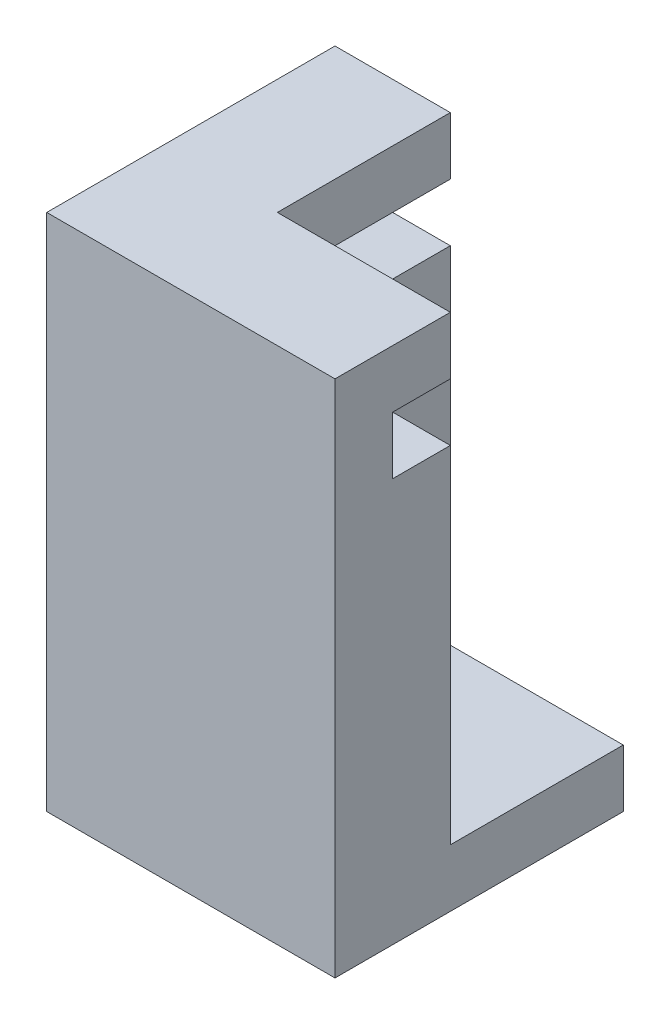
ISO-10303-21;
HEADER;
FILE_DESCRIPTION(('STEP AP214'),'2;1');
FILE_NAME('part.step','',(''),(''),'','','');
FILE_SCHEMA(('AUTOMOTIVE_DESIGN { 1 0 10303 214 1 1 1 1 }'));
ENDSEC;
DATA;
#1=APPLICATION_CONTEXT('core data for automotive mechanical design processes');
#2=APPLICATION_PROTOCOL_DEFINITION('international standard','automotive_design',2000,#1);
#3=PRODUCT_CONTEXT('',#1,'mechanical');
#4=PRODUCT('Part','Part','',(#3));
#5=PRODUCT_RELATED_PRODUCT_CATEGORY('part','',(#4));
#6=PRODUCT_DEFINITION_FORMATION('','',#4);
#7=PRODUCT_DEFINITION_CONTEXT('part definition',#1,'design');
#8=PRODUCT_DEFINITION('design','',#6,#7);
#9=PRODUCT_DEFINITION_SHAPE('','',#8);
#10=(LENGTH_UNIT() NAMED_UNIT(*) SI_UNIT(.MILLI.,.METRE.));
#11=(NAMED_UNIT(*) PLANE_ANGLE_UNIT() SI_UNIT($,.RADIAN.));
#12=(NAMED_UNIT(*) SI_UNIT($,.STERADIAN.) SOLID_ANGLE_UNIT());
#13=UNCERTAINTY_MEASURE_WITH_UNIT(LENGTH_MEASURE(1.E-05),#10,'distance_accuracy_value','');
#14=(GEOMETRIC_REPRESENTATION_CONTEXT(3) GLOBAL_UNCERTAINTY_ASSIGNED_CONTEXT((#13)) GLOBAL_UNIT_ASSIGNED_CONTEXT((#10,
#11,#12)) REPRESENTATION_CONTEXT('',''));
#15=CARTESIAN_POINT('',(0.,0.,0.));
#16=DIRECTION('',(0.,0.,1.));
#17=DIRECTION('',(1.,0.,0.));
#18=AXIS2_PLACEMENT_3D('',#15,#16,#17);
#19=CARTESIAN_POINT('',(25.,40.,-10.));
#20=DIRECTION('',(0.,0.,1.));
#21=DIRECTION('',(1.,0.,0.));
#22=AXIS2_PLACEMENT_3D('',#19,#20,#21);
#23=PLANE('',#22);
#24=DIRECTION('',(0.,-1.,0.));
#25=VECTOR('',#24,1.);
#26=CARTESIAN_POINT('',(10.,40.,-10.));
#27=LINE('',#26,#25);
#28=CARTESIAN_POINT('',(10.,30.,-10.));
#29=VERTEX_POINT('',#28);
#30=CARTESIAN_POINT('',(10.,0.,-10.));
#31=VERTEX_POINT('',#30);
#32=EDGE_CURVE('E77',#29,#31,#27,.T.);
#33=ORIENTED_EDGE('',*,*,#32,.F.);
#34=DIRECTION('',(1.,0.,0.));
#35=VECTOR('',#34,1.);
#36=CARTESIAN_POINT('',(25.,30.,-10.));
#37=LINE('',#36,#35);
#38=CARTESIAN_POINT('',(25.,30.,-10.));
#39=VERTEX_POINT('',#38);
#40=EDGE_CURVE('E194',#29,#39,#37,.T.);
#41=ORIENTED_EDGE('',*,*,#40,.T.);
#42=DIRECTION('',(0.,-1.,0.));
#43=VECTOR('',#42,1.);
#44=CARTESIAN_POINT('',(25.,40.,-10.));
#45=LINE('',#44,#43);
#46=CARTESIAN_POINT('',(25.,0.,-10.));
#47=VERTEX_POINT('',#46);
#48=EDGE_CURVE('E124',#39,#47,#45,.T.);
#49=ORIENTED_EDGE('',*,*,#48,.T.);
#50=DIRECTION('',(-1.,0.,0.));
#51=VECTOR('',#50,1.);
#52=CARTESIAN_POINT('',(25.,0.,-10.));
#53=LINE('',#52,#51);
#54=EDGE_CURVE('E136',#47,#31,#53,.T.);
#55=ORIENTED_EDGE('',*,*,#54,.T.);
#56=EDGE_LOOP('',(#33,#41,#49,#55));
#57=FACE_BOUND('',#56,.T.);
#58=ADVANCED_FACE('F39',(#57),#23,.F.);
#59=CARTESIAN_POINT('',(10.,40.,-10.));
#60=DIRECTION('',(-1.,0.,0.));
#61=DIRECTION('',(0.,0.,1.));
#62=AXIS2_PLACEMENT_3D('',#59,#60,#61);
#63=PLANE('',#62);
#64=DIRECTION('',(0.,-1.,0.));
#65=VECTOR('',#64,1.);
#66=CARTESIAN_POINT('',(10.,40.,-25.));
#67=LINE('',#66,#65);
#68=CARTESIAN_POINT('',(10.,30.,-25.));
#69=VERTEX_POINT('',#68);
#70=CARTESIAN_POINT('',(10.,0.,-25.));
#71=VERTEX_POINT('',#70);
#72=EDGE_CURVE('E88',#69,#71,#67,.T.);
#73=ORIENTED_EDGE('',*,*,#72,.F.);
#74=DIRECTION('',(0.,0.,1.));
#75=VECTOR('',#74,1.);
#76=CARTESIAN_POINT('',(10.,30.,-10.));
#77=LINE('',#76,#75);
#78=EDGE_CURVE('E276',#69,#29,#77,.T.);
#79=ORIENTED_EDGE('',*,*,#78,.T.);
#80=ORIENTED_EDGE('',*,*,#32,.T.);
#81=DIRECTION('',(0.,0.,-1.));
#82=VECTOR('',#81,1.);
#83=CARTESIAN_POINT('',(10.,0.,-10.));
#84=LINE('',#83,#82);
#85=EDGE_CURVE('E140',#31,#71,#84,.T.);
#86=ORIENTED_EDGE('',*,*,#85,.T.);
#87=EDGE_LOOP('',(#73,#79,#80,#86));
#88=FACE_BOUND('',#87,.T.);
#89=ADVANCED_FACE('F279',(#88),#63,.F.);
#90=CARTESIAN_POINT('',(0.,40.,-25.));
#91=DIRECTION('',(1.,0.,0.));
#92=DIRECTION('',(0.,0.,-1.));
#93=AXIS2_PLACEMENT_3D('',#90,#91,#92);
#94=PLANE('',#93);
#95=DIRECTION('',(0.,-1.,0.));
#96=VECTOR('',#95,1.);
#97=CARTESIAN_POINT('',(0.,40.,-25.));
#98=LINE('',#97,#96);
#99=CARTESIAN_POINT('',(0.,40.,-25.));
#100=VERTEX_POINT('',#99);
#101=CARTESIAN_POINT('',(0.,-5.,-25.));
#102=VERTEX_POINT('',#101);
#103=EDGE_CURVE('E132',#100,#102,#98,.T.);
#104=ORIENTED_EDGE('',*,*,#103,.T.);
#105=DIRECTION('',(0.,0.,-1.));
#106=VECTOR('',#105,1.);
#107=CARTESIAN_POINT('',(0.,-5.,0.));
#108=LINE('',#107,#106);
#109=CARTESIAN_POINT('',(0.,-5.,0.));
#110=VERTEX_POINT('',#109);
#111=EDGE_CURVE('E177',#110,#102,#108,.T.);
#112=ORIENTED_EDGE('',*,*,#111,.F.);
#113=DIRECTION('',(0.,-1.,0.));
#114=VECTOR('',#113,1.);
#115=CARTESIAN_POINT('',(0.,40.,0.));
#116=LINE('',#115,#114);
#117=CARTESIAN_POINT('',(0.,40.,0.));
#118=VERTEX_POINT('',#117);
#119=EDGE_CURVE('E48',#118,#110,#116,.T.);
#120=ORIENTED_EDGE('',*,*,#119,.F.);
#121=DIRECTION('',(0.,0.,1.));
#122=VECTOR('',#121,1.);
#123=CARTESIAN_POINT('',(0.,40.,-25.));
#124=LINE('',#123,#122);
#125=EDGE_CURVE('E144',#100,#118,#124,.T.);
#126=ORIENTED_EDGE('',*,*,#125,.F.);
#127=EDGE_LOOP('',(#104,#112,#120,#126));
#128=FACE_BOUND('',#127,.T.);
#129=ADVANCED_FACE('F41',(#128),#94,.F.);
#130=CARTESIAN_POINT('',(0.,40.,0.));
#131=DIRECTION('',(0.,0.,-1.));
#132=DIRECTION('',(-1.,0.,0.));
#133=AXIS2_PLACEMENT_3D('',#130,#131,#132);
#134=PLANE('',#133);
#135=ORIENTED_EDGE('',*,*,#119,.T.);
#136=DIRECTION('',(-1.,0.,0.));
#137=VECTOR('',#136,1.);
#138=CARTESIAN_POINT('',(0.,-5.,0.));
#139=LINE('',#138,#137);
#140=CARTESIAN_POINT('',(25.,-5.,0.));
#141=VERTEX_POINT('',#140);
#142=EDGE_CURVE('E165',#141,#110,#139,.T.);
#143=ORIENTED_EDGE('',*,*,#142,.F.);
#144=DIRECTION('',(0.,-1.,0.));
#145=VECTOR('',#144,1.);
#146=CARTESIAN_POINT('',(25.,40.,0.));
#147=LINE('',#146,#145);
#148=CARTESIAN_POINT('',(25.,40.,0.));
#149=VERTEX_POINT('',#148);
#150=EDGE_CURVE('E153',#149,#141,#147,.T.);
#151=ORIENTED_EDGE('',*,*,#150,.F.);
#152=DIRECTION('',(1.,0.,0.));
#153=VECTOR('',#152,1.);
#154=CARTESIAN_POINT('',(0.,40.,0.));
#155=LINE('',#154,#153);
#156=EDGE_CURVE('E166',#118,#149,#155,.T.);
#157=ORIENTED_EDGE('',*,*,#156,.F.);
#158=EDGE_LOOP('',(#135,#143,#151,#157));
#159=FACE_BOUND('',#158,.T.);
#160=ADVANCED_FACE('F162',(#159),#134,.F.);
#161=CARTESIAN_POINT('',(25.,40.,0.));
#162=DIRECTION('',(-1.,0.,0.));
#163=DIRECTION('',(0.,0.,1.));
#164=AXIS2_PLACEMENT_3D('',#161,#162,#163);
#165=PLANE('',#164);
#166=ORIENTED_EDGE('',*,*,#48,.F.);
#167=DIRECTION('',(0.,0.,-1.));
#168=VECTOR('',#167,1.);
#169=CARTESIAN_POINT('',(25.,30.,-5.));
#170=LINE('',#169,#168);
#171=CARTESIAN_POINT('',(25.,30.,-5.));
#172=VERTEX_POINT('',#171);
#173=EDGE_CURVE('E252',#172,#39,#170,.T.);
#174=ORIENTED_EDGE('',*,*,#173,.F.);
#175=DIRECTION('',(0.,-1.,0.));
#176=VECTOR('',#175,1.);
#177=CARTESIAN_POINT('',(25.,30.,-5.));
#178=LINE('',#177,#176);
#179=CARTESIAN_POINT('',(25.,35.,-5.));
#180=VERTEX_POINT('',#179);
#181=EDGE_CURVE('E255',#180,#172,#178,.T.);
#182=ORIENTED_EDGE('',*,*,#181,.F.);
#183=DIRECTION('',(0.,0.,-1.));
#184=VECTOR('',#183,1.);
#185=CARTESIAN_POINT('',(25.,35.,-5.));
#186=LINE('',#185,#184);
#187=CARTESIAN_POINT('',(25.,35.,-10.));
#188=VERTEX_POINT('',#187);
#189=EDGE_CURVE('E215',#180,#188,#186,.T.);
#190=ORIENTED_EDGE('',*,*,#189,.T.);
#191=CARTESIAN_POINT('',(25.,40.,-10.));
#192=VERTEX_POINT('',#191);
#193=EDGE_CURVE('E150',#192,#188,#45,.T.);
#194=ORIENTED_EDGE('',*,*,#193,.F.);
#195=DIRECTION('',(0.,0.,-1.));
#196=VECTOR('',#195,1.);
#197=CARTESIAN_POINT('',(25.,40.,0.));
#198=LINE('',#197,#196);
#199=EDGE_CURVE('E108',#149,#192,#198,.T.);
#200=ORIENTED_EDGE('',*,*,#199,.F.);
#201=ORIENTED_EDGE('',*,*,#150,.T.);
#202=DIRECTION('',(0.,0.,1.));
#203=VECTOR('',#202,1.);
#204=CARTESIAN_POINT('',(25.,-5.,0.));
#205=LINE('',#204,#203);
#206=CARTESIAN_POINT('',(25.,-5.,-25.));
#207=VERTEX_POINT('',#206);
#208=EDGE_CURVE('E179',#207,#141,#205,.T.);
#209=ORIENTED_EDGE('',*,*,#208,.F.);
#210=DIRECTION('',(0.,1.,0.));
#211=VECTOR('',#210,1.);
#212=CARTESIAN_POINT('',(25.,-5.,-25.));
#213=LINE('',#212,#211);
#214=CARTESIAN_POINT('',(25.,0.,-25.));
#215=VERTEX_POINT('',#214);
#216=EDGE_CURVE('E141',#207,#215,#213,.T.);
#217=ORIENTED_EDGE('',*,*,#216,.T.);
#218=DIRECTION('',(0.,0.,1.));
#219=VECTOR('',#218,1.);
#220=CARTESIAN_POINT('',(25.,0.,0.));
#221=LINE('',#220,#219);
#222=EDGE_CURVE('E185',#215,#47,#221,.T.);
#223=ORIENTED_EDGE('',*,*,#222,.T.);
#224=EDGE_LOOP('',(#166,#174,#182,#190,#194,#200,#201,#209,#217,#223));
#225=FACE_BOUND('',#224,.T.);
#226=ADVANCED_FACE('F210',(#225),#165,.F.);
#227=ORIENTED_EDGE('',*,*,#193,.T.);
#228=DIRECTION('',(-1.,0.,0.));
#229=VECTOR('',#228,1.);
#230=CARTESIAN_POINT('',(25.,35.,-10.));
#231=LINE('',#230,#229);
#232=CARTESIAN_POINT('',(10.,35.,-10.));
#233=VERTEX_POINT('',#232);
#234=EDGE_CURVE('E120',#188,#233,#231,.T.);
#235=ORIENTED_EDGE('',*,*,#234,.T.);
#236=CARTESIAN_POINT('',(10.,40.,-10.));
#237=VERTEX_POINT('',#236);
#238=EDGE_CURVE('E116',#237,#233,#27,.T.);
#239=ORIENTED_EDGE('',*,*,#238,.F.);
#240=DIRECTION('',(-1.,0.,0.));
#241=VECTOR('',#240,1.);
#242=CARTESIAN_POINT('',(25.,40.,-10.));
#243=LINE('',#242,#241);
#244=EDGE_CURVE('E101',#192,#237,#243,.T.);
#245=ORIENTED_EDGE('',*,*,#244,.F.);
#246=EDGE_LOOP('',(#227,#235,#239,#245));
#247=FACE_BOUND('',#246,.T.);
#248=ADVANCED_FACE('F117',(#247),#23,.F.);
#249=ORIENTED_EDGE('',*,*,#238,.T.);
#250=DIRECTION('',(0.,0.,-1.));
#251=VECTOR('',#250,1.);
#252=CARTESIAN_POINT('',(10.,35.,-10.));
#253=LINE('',#252,#251);
#254=CARTESIAN_POINT('',(10.,35.,-25.));
#255=VERTEX_POINT('',#254);
#256=EDGE_CURVE('E264',#233,#255,#253,.T.);
#257=ORIENTED_EDGE('',*,*,#256,.T.);
#258=CARTESIAN_POINT('',(10.,40.,-25.));
#259=VERTEX_POINT('',#258);
#260=EDGE_CURVE('E128',#259,#255,#67,.T.);
#261=ORIENTED_EDGE('',*,*,#260,.F.);
#262=DIRECTION('',(0.,0.,-1.));
#263=VECTOR('',#262,1.);
#264=CARTESIAN_POINT('',(10.,40.,-10.));
#265=LINE('',#264,#263);
#266=EDGE_CURVE('E105',#237,#259,#265,.T.);
#267=ORIENTED_EDGE('',*,*,#266,.F.);
#268=EDGE_LOOP('',(#249,#257,#261,#267));
#269=FACE_BOUND('',#268,.T.);
#270=ADVANCED_FACE('F126',(#269),#63,.F.);
#271=CARTESIAN_POINT('',(10.,40.,-25.));
#272=DIRECTION('',(0.,0.,1.));
#273=DIRECTION('',(1.,0.,0.));
#274=AXIS2_PLACEMENT_3D('',#271,#272,#273);
#275=PLANE('',#274);
#276=DIRECTION('',(0.,1.,0.));
#277=VECTOR('',#276,1.);
#278=CARTESIAN_POINT('',(5.,30.,-25.));
#279=LINE('',#278,#277);
#280=CARTESIAN_POINT('',(5.,30.,-25.));
#281=VERTEX_POINT('',#280);
#282=CARTESIAN_POINT('',(5.,35.,-25.));
#283=VERTEX_POINT('',#282);
#284=EDGE_CURVE('E55',#281,#283,#279,.T.);
#285=ORIENTED_EDGE('',*,*,#284,.F.);
#286=DIRECTION('',(1.,0.,0.));
#287=VECTOR('',#286,1.);
#288=CARTESIAN_POINT('',(10.,30.,-25.));
#289=LINE('',#288,#287);
#290=EDGE_CURVE('E11',#281,#69,#289,.T.);
#291=ORIENTED_EDGE('',*,*,#290,.T.);
#292=ORIENTED_EDGE('',*,*,#72,.T.);
#293=DIRECTION('',(1.,0.,0.));
#294=VECTOR('',#293,1.);
#295=CARTESIAN_POINT('',(0.,0.,-25.));
#296=LINE('',#295,#294);
#297=EDGE_CURVE('E191',#71,#215,#296,.T.);
#298=ORIENTED_EDGE('',*,*,#297,.T.);
#299=ORIENTED_EDGE('',*,*,#216,.F.);
#300=DIRECTION('',(1.,0.,0.));
#301=VECTOR('',#300,1.);
#302=CARTESIAN_POINT('',(0.,-5.,-25.));
#303=LINE('',#302,#301);
#304=EDGE_CURVE('E184',#102,#207,#303,.T.);
#305=ORIENTED_EDGE('',*,*,#304,.F.);
#306=ORIENTED_EDGE('',*,*,#103,.F.);
#307=DIRECTION('',(-1.,0.,0.));
#308=VECTOR('',#307,1.);
#309=CARTESIAN_POINT('',(10.,40.,-25.));
#310=LINE('',#309,#308);
#311=EDGE_CURVE('E64',#259,#100,#310,.T.);
#312=ORIENTED_EDGE('',*,*,#311,.F.);
#313=ORIENTED_EDGE('',*,*,#260,.T.);
#314=DIRECTION('',(1.,0.,0.));
#315=VECTOR('',#314,1.);
#316=CARTESIAN_POINT('',(5.,35.,-25.));
#317=LINE('',#316,#315);
#318=EDGE_CURVE('E285',#283,#255,#317,.T.);
#319=ORIENTED_EDGE('',*,*,#318,.F.);
#320=EDGE_LOOP('',(#285,#291,#292,#298,#299,#305,#306,#312,#313,#319));
#321=FACE_BOUND('',#320,.T.);
#322=ADVANCED_FACE('F240',(#321),#275,.F.);
#323=CARTESIAN_POINT('',(0.,40.,0.));
#324=DIRECTION('',(0.,1.,0.));
#325=DIRECTION('',(0.,0.,1.));
#326=AXIS2_PLACEMENT_3D('',#323,#324,#325);
#327=PLANE('',#326);
#328=ORIENTED_EDGE('',*,*,#125,.T.);
#329=ORIENTED_EDGE('',*,*,#156,.T.);
#330=ORIENTED_EDGE('',*,*,#199,.T.);
#331=ORIENTED_EDGE('',*,*,#244,.T.);
#332=ORIENTED_EDGE('',*,*,#266,.T.);
#333=ORIENTED_EDGE('',*,*,#311,.T.);
#334=EDGE_LOOP('',(#328,#329,#330,#331,#332,#333));
#335=FACE_BOUND('',#334,.T.);
#336=ADVANCED_FACE('F103',(#335),#327,.T.);
#337=CARTESIAN_POINT('',(0.,-5.,0.));
#338=DIRECTION('',(0.,-1.,0.));
#339=DIRECTION('',(0.,0.,-1.));
#340=AXIS2_PLACEMENT_3D('',#337,#338,#339);
#341=PLANE('',#340);
#342=ORIENTED_EDGE('',*,*,#111,.T.);
#343=ORIENTED_EDGE('',*,*,#304,.T.);
#344=ORIENTED_EDGE('',*,*,#208,.T.);
#345=ORIENTED_EDGE('',*,*,#142,.T.);
#346=EDGE_LOOP('',(#342,#343,#344,#345));
#347=FACE_BOUND('',#346,.T.);
#348=ADVANCED_FACE('F174',(#347),#341,.T.);
#349=CARTESIAN_POINT('',(0.,0.,0.));
#350=DIRECTION('',(0.,-1.,0.));
#351=DIRECTION('',(0.,0.,-1.));
#352=AXIS2_PLACEMENT_3D('',#349,#350,#351);
#353=PLANE('',#352);
#354=ORIENTED_EDGE('',*,*,#85,.F.);
#355=ORIENTED_EDGE('',*,*,#54,.F.);
#356=ORIENTED_EDGE('',*,*,#222,.F.);
#357=ORIENTED_EDGE('',*,*,#297,.F.);
#358=EDGE_LOOP('',(#354,#355,#356,#357));
#359=FACE_BOUND('',#358,.T.);
#360=ADVANCED_FACE('F244',(#359),#353,.F.);
#361=CARTESIAN_POINT('',(5.,30.,-5.));
#362=DIRECTION('',(0.,-1.,0.));
#363=DIRECTION('',(1.,0.,0.));
#364=AXIS2_PLACEMENT_3D('',#361,#362,#363);
#365=PLANE('',#364);
#366=ORIENTED_EDGE('',*,*,#78,.F.);
#367=ORIENTED_EDGE('',*,*,#290,.F.);
#368=DIRECTION('',(0.,0.,-1.));
#369=VECTOR('',#368,1.);
#370=CARTESIAN_POINT('',(5.,30.,-5.));
#371=LINE('',#370,#369);
#372=CARTESIAN_POINT('',(5.,30.,-5.));
#373=VERTEX_POINT('',#372);
#374=EDGE_CURVE('E260',#373,#281,#371,.T.);
#375=ORIENTED_EDGE('',*,*,#374,.F.);
#376=DIRECTION('',(-1.,0.,0.));
#377=VECTOR('',#376,1.);
#378=CARTESIAN_POINT('',(5.,30.,-5.));
#379=LINE('',#378,#377);
#380=EDGE_CURVE('E272',#172,#373,#379,.T.);
#381=ORIENTED_EDGE('',*,*,#380,.F.);
#382=ORIENTED_EDGE('',*,*,#173,.T.);
#383=ORIENTED_EDGE('',*,*,#40,.F.);
#384=EDGE_LOOP('',(#366,#367,#375,#381,#382,#383));
#385=FACE_BOUND('',#384,.T.);
#386=ADVANCED_FACE('F281',(#385),#365,.F.);
#387=CARTESIAN_POINT('',(5.,35.,-5.));
#388=DIRECTION('',(0.,1.,0.));
#389=DIRECTION('',(0.,0.,1.));
#390=AXIS2_PLACEMENT_3D('',#387,#388,#389);
#391=PLANE('',#390);
#392=ORIENTED_EDGE('',*,*,#189,.F.);
#393=DIRECTION('',(1.,0.,0.));
#394=VECTOR('',#393,1.);
#395=CARTESIAN_POINT('',(5.,35.,-5.));
#396=LINE('',#395,#394);
#397=CARTESIAN_POINT('',(5.,35.,-5.));
#398=VERTEX_POINT('',#397);
#399=EDGE_CURVE('E297',#398,#180,#396,.T.);
#400=ORIENTED_EDGE('',*,*,#399,.F.);
#401=DIRECTION('',(0.,0.,-1.));
#402=VECTOR('',#401,1.);
#403=CARTESIAN_POINT('',(5.,35.,-5.));
#404=LINE('',#403,#402);
#405=EDGE_CURVE('E266',#398,#283,#404,.T.);
#406=ORIENTED_EDGE('',*,*,#405,.T.);
#407=ORIENTED_EDGE('',*,*,#318,.T.);
#408=ORIENTED_EDGE('',*,*,#256,.F.);
#409=ORIENTED_EDGE('',*,*,#234,.F.);
#410=EDGE_LOOP('',(#392,#400,#406,#407,#408,#409));
#411=FACE_BOUND('',#410,.T.);
#412=ADVANCED_FACE('F311',(#411),#391,.F.);
#413=CARTESIAN_POINT('',(5.,30.,-5.));
#414=DIRECTION('',(-1.,0.,0.));
#415=DIRECTION('',(0.,0.,1.));
#416=AXIS2_PLACEMENT_3D('',#413,#414,#415);
#417=PLANE('',#416);
#418=ORIENTED_EDGE('',*,*,#284,.T.);
#419=ORIENTED_EDGE('',*,*,#405,.F.);
#420=DIRECTION('',(0.,1.,0.));
#421=VECTOR('',#420,1.);
#422=CARTESIAN_POINT('',(5.,30.,-5.));
#423=LINE('',#422,#421);
#424=EDGE_CURVE('E290',#373,#398,#423,.T.);
#425=ORIENTED_EDGE('',*,*,#424,.F.);
#426=ORIENTED_EDGE('',*,*,#374,.T.);
#427=EDGE_LOOP('',(#418,#419,#425,#426));
#428=FACE_BOUND('',#427,.T.);
#429=ADVANCED_FACE('F308',(#428),#417,.F.);
#430=CARTESIAN_POINT('',(0.,0.,-5.));
#431=DIRECTION('',(0.,0.,-1.));
#432=DIRECTION('',(-1.,0.,0.));
#433=AXIS2_PLACEMENT_3D('',#430,#431,#432);
#434=PLANE('',#433);
#435=ORIENTED_EDGE('',*,*,#424,.T.);
#436=ORIENTED_EDGE('',*,*,#399,.T.);
#437=ORIENTED_EDGE('',*,*,#181,.T.);
#438=ORIENTED_EDGE('',*,*,#380,.T.);
#439=EDGE_LOOP('',(#435,#436,#437,#438));
#440=FACE_BOUND('',#439,.T.);
#441=ADVANCED_FACE('F305',(#440),#434,.T.);
#442=CLOSED_SHELL('',(#58,#89,#129,#160,#226,#248,#270,#322,#336,#348,#360,#386,#412,#429,#441));
#443=MANIFOLD_SOLID_BREP('B2',#442);
#444=ADVANCED_BREP_SHAPE_REPRESENTATION('',(#18,#443),#14);
#445=SHAPE_DEFINITION_REPRESENTATION(#9,#444);
ENDSEC;
END-ISO-10303-21;
